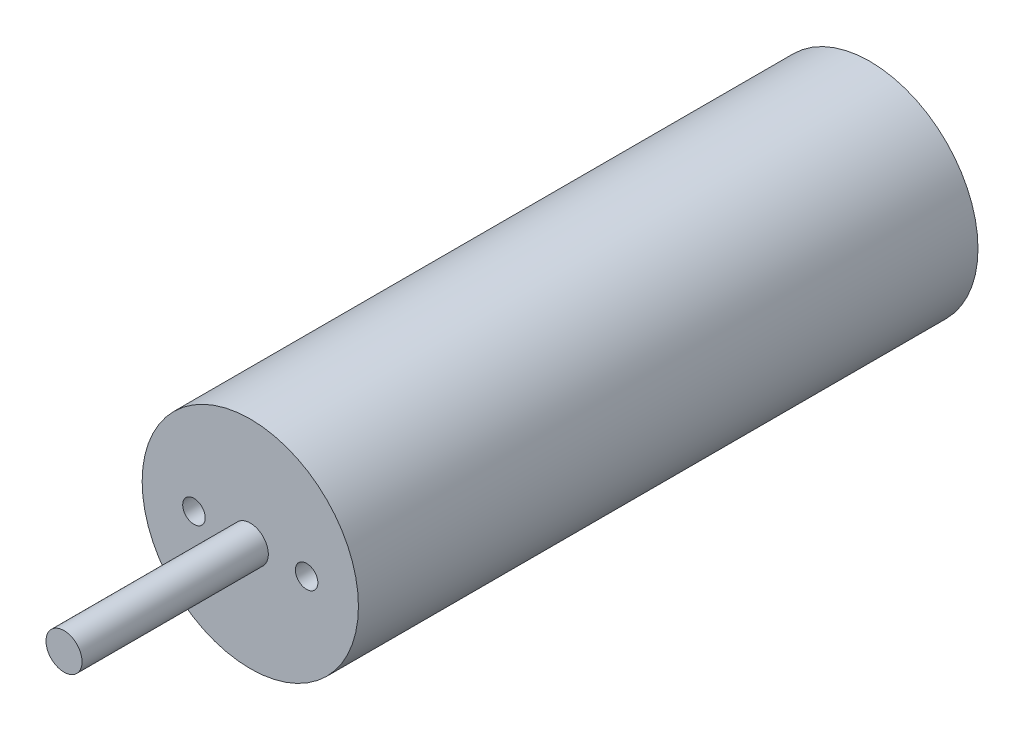
ISO-10303-21;
HEADER;
FILE_DESCRIPTION(('STEP AP214'),'2;1');
FILE_NAME('part.step','',(''),(''),'','','');
FILE_SCHEMA(('AUTOMOTIVE_DESIGN { 1 0 10303 214 1 1 1 1 }'));
ENDSEC;
DATA;
#1=APPLICATION_CONTEXT('core data for automotive mechanical design processes');
#2=APPLICATION_PROTOCOL_DEFINITION('international standard','automotive_design',2000,#1);
#3=PRODUCT_CONTEXT('',#1,'mechanical');
#4=PRODUCT('Part','Part','',(#3));
#5=PRODUCT_RELATED_PRODUCT_CATEGORY('part','',(#4));
#6=PRODUCT_DEFINITION_FORMATION('','',#4);
#7=PRODUCT_DEFINITION_CONTEXT('part definition',#1,'design');
#8=PRODUCT_DEFINITION('design','',#6,#7);
#9=PRODUCT_DEFINITION_SHAPE('','',#8);
#10=(LENGTH_UNIT() NAMED_UNIT(*) SI_UNIT(.MILLI.,.METRE.));
#11=(NAMED_UNIT(*) PLANE_ANGLE_UNIT() SI_UNIT($,.RADIAN.));
#12=(NAMED_UNIT(*) SI_UNIT($,.STERADIAN.) SOLID_ANGLE_UNIT());
#13=UNCERTAINTY_MEASURE_WITH_UNIT(LENGTH_MEASURE(1.E-05),#10,'distance_accuracy_value','');
#14=(GEOMETRIC_REPRESENTATION_CONTEXT(3) GLOBAL_UNCERTAINTY_ASSIGNED_CONTEXT((#13)) GLOBAL_UNIT_ASSIGNED_CONTEXT((#10,
#11,#12)) REPRESENTATION_CONTEXT('',''));
#15=CARTESIAN_POINT('',(0.,0.,0.));
#16=DIRECTION('',(0.,0.,1.));
#17=DIRECTION('',(1.,0.,0.));
#18=AXIS2_PLACEMENT_3D('',#15,#16,#17);
#19=CARTESIAN_POINT('',(0.,0.,69.85));
#20=DIRECTION('',(0.,0.,-1.));
#21=DIRECTION('',(-1.,0.,0.));
#22=AXIS2_PLACEMENT_3D('',#19,#20,#21);
#23=CYLINDRICAL_SURFACE('',#22,12.192);
#24=CARTESIAN_POINT('',(0.,0.,69.85));
#25=DIRECTION('',(0.,0.,1.));
#26=DIRECTION('',(1.,0.,0.));
#27=AXIS2_PLACEMENT_3D('',#24,#25,#26);
#28=CIRCLE('',#27,12.192);
#29=CARTESIAN_POINT('',(12.192,0.,69.85));
#30=VERTEX_POINT('',#29);
#31=EDGE_CURVE('E38',#30,#30,#28,.T.);
#32=ORIENTED_EDGE('',*,*,#31,.F.);
#33=EDGE_LOOP('',(#32));
#34=FACE_BOUND('',#33,.T.);
#35=CARTESIAN_POINT('',(0.,0.,0.));
#36=DIRECTION('',(0.,0.,1.));
#37=DIRECTION('',(1.,0.,0.));
#38=AXIS2_PLACEMENT_3D('',#35,#36,#37);
#39=CIRCLE('',#38,12.192);
#40=CARTESIAN_POINT('',(12.192,0.,0.));
#41=VERTEX_POINT('',#40);
#42=EDGE_CURVE('E34',#41,#41,#39,.T.);
#43=ORIENTED_EDGE('',*,*,#42,.T.);
#44=EDGE_LOOP('',(#43));
#45=FACE_BOUND('',#44,.T.);
#46=ADVANCED_FACE('F31',(#34,#45),#23,.T.);
#47=CARTESIAN_POINT('',(0.,0.,69.85));
#48=DIRECTION('',(0.,0.,1.));
#49=DIRECTION('',(1.,0.,0.));
#50=AXIS2_PLACEMENT_3D('',#47,#48,#49);
#51=PLANE('',#50);
#52=CARTESIAN_POINT('',(6.35,0.,69.85));
#53=DIRECTION('',(0.,0.,1.));
#54=DIRECTION('',(1.,0.,0.));
#55=AXIS2_PLACEMENT_3D('',#52,#53,#54);
#56=CIRCLE('',#55,1.27);
#57=CARTESIAN_POINT('',(7.62,0.,69.85));
#58=VERTEX_POINT('',#57);
#59=EDGE_CURVE('E54',#58,#58,#56,.T.);
#60=ORIENTED_EDGE('',*,*,#59,.F.);
#61=EDGE_LOOP('',(#60));
#62=FACE_BOUND('',#61,.T.);
#63=CARTESIAN_POINT('',(-6.35,0.,69.85));
#64=DIRECTION('',(0.,0.,1.));
#65=DIRECTION('',(1.,0.,0.));
#66=AXIS2_PLACEMENT_3D('',#63,#64,#65);
#67=CIRCLE('',#66,1.27);
#68=CARTESIAN_POINT('',(-5.08,0.,69.85));
#69=VERTEX_POINT('',#68);
#70=EDGE_CURVE('E48',#69,#69,#67,.T.);
#71=ORIENTED_EDGE('',*,*,#70,.F.);
#72=EDGE_LOOP('',(#71));
#73=FACE_BOUND('',#72,.T.);
#74=CARTESIAN_POINT('',(0.,0.,69.85));
#75=DIRECTION('',(0.,0.,1.));
#76=DIRECTION('',(1.,0.,0.));
#77=AXIS2_PLACEMENT_3D('',#74,#75,#76);
#78=CIRCLE('',#77,2.032);
#79=CARTESIAN_POINT('',(-2.032,0.,69.85));
#80=VERTEX_POINT('',#79);
#81=EDGE_CURVE('E10',#80,#80,#78,.T.);
#82=ORIENTED_EDGE('',*,*,#81,.F.);
#83=EDGE_LOOP('',(#82));
#84=FACE_BOUND('',#83,.T.);
#85=ORIENTED_EDGE('',*,*,#31,.T.);
#86=EDGE_LOOP('',(#85));
#87=FACE_BOUND('',#86,.T.);
#88=ADVANCED_FACE('F69',(#62,#73,#84,#87),#51,.T.);
#89=CARTESIAN_POINT('',(0.,0.,0.));
#90=DIRECTION('',(0.,0.,1.));
#91=DIRECTION('',(1.,0.,0.));
#92=AXIS2_PLACEMENT_3D('',#89,#90,#91);
#93=PLANE('',#92);
#94=ORIENTED_EDGE('',*,*,#42,.F.);
#95=EDGE_LOOP('',(#94));
#96=FACE_BOUND('',#95,.T.);
#97=ADVANCED_FACE('F72',(#96),#93,.F.);
#98=CARTESIAN_POINT('',(0.,0.,90.85));
#99=DIRECTION('',(0.,0.,-1.));
#100=DIRECTION('',(-1.,0.,0.));
#101=AXIS2_PLACEMENT_3D('',#98,#99,#100);
#102=CYLINDRICAL_SURFACE('',#101,2.032);
#103=CARTESIAN_POINT('',(0.,0.,90.85));
#104=DIRECTION('',(0.,0.,1.));
#105=DIRECTION('',(1.,0.,0.));
#106=AXIS2_PLACEMENT_3D('',#103,#104,#105);
#107=CIRCLE('',#106,2.032);
#108=CARTESIAN_POINT('',(-2.032,0.,90.85));
#109=VERTEX_POINT('',#108);
#110=EDGE_CURVE('E44',#109,#109,#107,.T.);
#111=CARTESIAN_POINT('',(-2.032,0.,90.85));
#112=CARTESIAN_POINT('',(-2.032,0.,90.63125));
#113=CARTESIAN_POINT('',(-2.032,0.,90.4125));
#114=CARTESIAN_POINT('',(-2.032,0.,89.975));
#115=CARTESIAN_POINT('',(-2.032,0.,89.75625));
#116=CARTESIAN_POINT('',(-2.032,0.,89.31875));
#117=CARTESIAN_POINT('',(-2.032,0.,89.1));
#118=CARTESIAN_POINT('',(-2.032,0.,88.6625));
#119=CARTESIAN_POINT('',(-2.032,0.,88.44375));
#120=CARTESIAN_POINT('',(-2.032,0.,88.00625));
#121=CARTESIAN_POINT('',(-2.032,0.,87.7875));
#122=CARTESIAN_POINT('',(-2.032,0.,87.35));
#123=CARTESIAN_POINT('',(-2.032,0.,87.13125));
#124=CARTESIAN_POINT('',(-2.032,0.,86.69375));
#125=CARTESIAN_POINT('',(-2.032,0.,86.475));
#126=CARTESIAN_POINT('',(-2.032,0.,86.0375));
#127=CARTESIAN_POINT('',(-2.032,0.,85.81875));
#128=CARTESIAN_POINT('',(-2.032,0.,85.38125));
#129=CARTESIAN_POINT('',(-2.032,0.,85.1625));
#130=CARTESIAN_POINT('',(-2.032,0.,84.725));
#131=CARTESIAN_POINT('',(-2.032,0.,84.50625));
#132=CARTESIAN_POINT('',(-2.032,0.,84.06875));
#133=CARTESIAN_POINT('',(-2.032,0.,83.85));
#134=CARTESIAN_POINT('',(-2.032,0.,83.4125));
#135=CARTESIAN_POINT('',(-2.032,0.,83.19375));
#136=CARTESIAN_POINT('',(-2.032,0.,82.75625));
#137=CARTESIAN_POINT('',(-2.032,0.,82.5375));
#138=CARTESIAN_POINT('',(-2.032,0.,82.1));
#139=CARTESIAN_POINT('',(-2.032,0.,81.88125));
#140=CARTESIAN_POINT('',(-2.032,0.,81.44375));
#141=CARTESIAN_POINT('',(-2.032,0.,81.225));
#142=CARTESIAN_POINT('',(-2.032,0.,80.7875));
#143=CARTESIAN_POINT('',(-2.032,0.,80.56875));
#144=CARTESIAN_POINT('',(-2.032,0.,80.13125));
#145=CARTESIAN_POINT('',(-2.032,0.,79.9125));
#146=CARTESIAN_POINT('',(-2.032,0.,79.475));
#147=CARTESIAN_POINT('',(-2.032,0.,79.25625));
#148=CARTESIAN_POINT('',(-2.032,0.,78.81875));
#149=CARTESIAN_POINT('',(-2.032,0.,78.6));
#150=CARTESIAN_POINT('',(-2.032,0.,78.1625));
#151=CARTESIAN_POINT('',(-2.032,0.,77.94375));
#152=CARTESIAN_POINT('',(-2.032,0.,77.50625));
#153=CARTESIAN_POINT('',(-2.032,0.,77.2875));
#154=CARTESIAN_POINT('',(-2.032,0.,76.85));
#155=CARTESIAN_POINT('',(-2.032,0.,76.63125));
#156=CARTESIAN_POINT('',(-2.032,0.,76.19375));
#157=CARTESIAN_POINT('',(-2.032,0.,75.975));
#158=CARTESIAN_POINT('',(-2.032,0.,75.5375));
#159=CARTESIAN_POINT('',(-2.032,0.,75.31875));
#160=CARTESIAN_POINT('',(-2.032,0.,74.88125));
#161=CARTESIAN_POINT('',(-2.032,0.,74.6625));
#162=CARTESIAN_POINT('',(-2.032,0.,74.225));
#163=CARTESIAN_POINT('',(-2.032,0.,74.00625));
#164=CARTESIAN_POINT('',(-2.032,0.,73.56875));
#165=CARTESIAN_POINT('',(-2.032,0.,73.35));
#166=CARTESIAN_POINT('',(-2.032,0.,72.9125));
#167=CARTESIAN_POINT('',(-2.032,0.,72.69375));
#168=CARTESIAN_POINT('',(-2.032,0.,72.25625));
#169=CARTESIAN_POINT('',(-2.032,0.,72.0375));
#170=CARTESIAN_POINT('',(-2.032,0.,71.6));
#171=CARTESIAN_POINT('',(-2.032,0.,71.38125));
#172=CARTESIAN_POINT('',(-2.032,0.,70.94375));
#173=CARTESIAN_POINT('',(-2.032,0.,70.725));
#174=CARTESIAN_POINT('',(-2.032,0.,70.2875));
#175=CARTESIAN_POINT('',(-2.032,0.,70.06875));
#176=CARTESIAN_POINT('',(-2.032,0.,69.85));
#177=B_SPLINE_CURVE_WITH_KNOTS('',3,(#111,#112,#113,#114,#115,#116,#117,#118,#119,#120,#121,
#122,#123,#124,#125,#126,#127,#128,#129,#130,#131,#132,#133,#134,#135,#136,#137,#138,#139,#140,
#141,#142,#143,#144,#145,#146,#147,#148,#149,#150,#151,#152,#153,#154,#155,#156,#157,#158,#159,
#160,#161,#162,#163,#164,#165,#166,#167,#168,#169,#170,#171,#172,#173,#174,#175,#176),
.UNSPECIFIED.,.F.,.F.,(4,2,2,2,2,2,2,2,2,2,2,2,2,2,2,2,2,2,2,2,2,2,2,2,2,2,2,2,2,2,2,2,4),(0.,
0.656250000000011,1.31250000000001,1.96875000000001,2.625,3.28125000000001,3.93750000000001,
4.59375000000001,5.25,5.90625000000002,6.56250000000001,7.21875000000001,7.87500000000001,
8.53125,9.18750000000001,9.84375000000001,10.5,11.15625,11.8125,12.46875,13.125,13.78125,
14.4375,15.09375,15.75,16.40625,17.0625,17.71875,18.375,19.03125,19.6875,20.34375,21.),.UNSPECIFIED.);
#178=EDGE_CURVE('BSEAM85',#109,#80,#177,.T.);
#179=ORIENTED_EDGE('',*,*,#110,.F.);
#180=ORIENTED_EDGE('',*,*,#81,.T.);
#181=ORIENTED_EDGE('',*,*,#178,.T.);
#182=ORIENTED_EDGE('',*,*,#178,.F.);
#183=EDGE_LOOP('',(#179,#181,#180,#182));
#184=FACE_BOUND('',#183,.T.);
#185=ADVANCED_FACE('F85',(#184),#102,.T.);
#186=CARTESIAN_POINT('',(0.,0.,90.85));
#187=DIRECTION('',(0.,0.,1.));
#188=DIRECTION('',(1.,0.,0.));
#189=AXIS2_PLACEMENT_3D('',#186,#187,#188);
#190=PLANE('',#189);
#191=ORIENTED_EDGE('',*,*,#110,.T.);
#192=EDGE_LOOP('',(#191));
#193=FACE_BOUND('',#192,.T.);
#194=ADVANCED_FACE('F89',(#193),#190,.T.);
#195=CARTESIAN_POINT('',(-6.35,0.,58.42));
#196=DIRECTION('',(0.,0.,1.));
#197=DIRECTION('',(1.,0.,0.));
#198=AXIS2_PLACEMENT_3D('',#195,#196,#197);
#199=CYLINDRICAL_SURFACE('',#198,1.27);
#200=CARTESIAN_POINT('',(-6.35,0.,58.42));
#201=DIRECTION('',(0.,0.,1.));
#202=DIRECTION('',(1.,0.,0.));
#203=AXIS2_PLACEMENT_3D('',#200,#201,#202);
#204=CIRCLE('',#203,1.27);
#205=CARTESIAN_POINT('',(-5.08,0.,58.42));
#206=VERTEX_POINT('',#205);
#207=EDGE_CURVE('E51',#206,#206,#204,.T.);
#208=ORIENTED_EDGE('',*,*,#207,.F.);
#209=EDGE_LOOP('',(#208));
#210=FACE_BOUND('',#209,.T.);
#211=ORIENTED_EDGE('',*,*,#70,.T.);
#212=EDGE_LOOP('',(#211));
#213=FACE_BOUND('',#212,.T.);
#214=ADVANCED_FACE('F95',(#210,#213),#199,.F.);
#215=CARTESIAN_POINT('',(-6.35,0.,58.42));
#216=DIRECTION('',(0.,0.,1.));
#217=DIRECTION('',(1.,0.,0.));
#218=AXIS2_PLACEMENT_3D('',#215,#216,#217);
#219=PLANE('',#218);
#220=ORIENTED_EDGE('',*,*,#207,.T.);
#221=EDGE_LOOP('',(#220));
#222=FACE_BOUND('',#221,.T.);
#223=ADVANCED_FACE('F65',(#222),#219,.T.);
#224=CARTESIAN_POINT('',(6.35,0.,58.42));
#225=DIRECTION('',(0.,0.,1.));
#226=DIRECTION('',(1.,0.,0.));
#227=AXIS2_PLACEMENT_3D('',#224,#225,#226);
#228=CYLINDRICAL_SURFACE('',#227,1.27);
#229=CARTESIAN_POINT('',(6.35,0.,58.42));
#230=DIRECTION('',(0.,0.,1.));
#231=DIRECTION('',(1.,0.,0.));
#232=AXIS2_PLACEMENT_3D('',#229,#230,#231);
#233=CIRCLE('',#232,1.27);
#234=CARTESIAN_POINT('',(7.62,0.,58.42));
#235=VERTEX_POINT('',#234);
#236=EDGE_CURVE('E47',#235,#235,#233,.T.);
#237=ORIENTED_EDGE('',*,*,#236,.F.);
#238=EDGE_LOOP('',(#237));
#239=FACE_BOUND('',#238,.T.);
#240=ORIENTED_EDGE('',*,*,#59,.T.);
#241=EDGE_LOOP('',(#240));
#242=FACE_BOUND('',#241,.T.);
#243=ADVANCED_FACE('F62',(#239,#242),#228,.F.);
#244=CARTESIAN_POINT('',(6.35,0.,58.42));
#245=DIRECTION('',(0.,0.,1.));
#246=DIRECTION('',(1.,0.,0.));
#247=AXIS2_PLACEMENT_3D('',#244,#245,#246);
#248=PLANE('',#247);
#249=ORIENTED_EDGE('',*,*,#236,.T.);
#250=EDGE_LOOP('',(#249));
#251=FACE_BOUND('',#250,.T.);
#252=ADVANCED_FACE('F60',(#251),#248,.T.);
#253=CLOSED_SHELL('',(#46,#88,#97,#185,#194,#214,#223,#243,#252));
#254=MANIFOLD_SOLID_BREP('B2',#253);
#255=ADVANCED_BREP_SHAPE_REPRESENTATION('',(#18,#254),#14);
#256=SHAPE_DEFINITION_REPRESENTATION(#9,#255);
ENDSEC;
END-ISO-10303-21;
